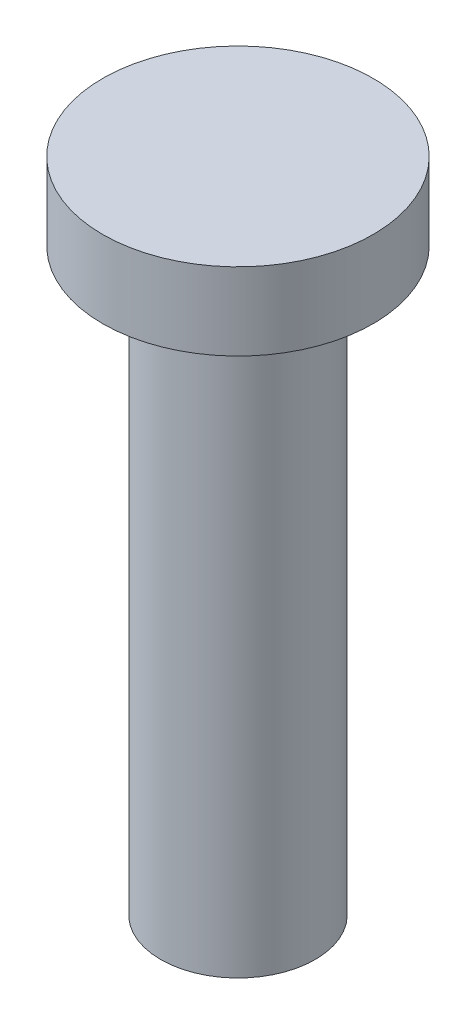
ISO-10303-21;
HEADER;
FILE_DESCRIPTION(('STEP AP214'),'2;1');
FILE_NAME('part.step','',(''),(''),'','','');
FILE_SCHEMA(('AUTOMOTIVE_DESIGN { 1 0 10303 214 1 1 1 1 }'));
ENDSEC;
DATA;
#1=APPLICATION_CONTEXT('core data for automotive mechanical design processes');
#2=APPLICATION_PROTOCOL_DEFINITION('international standard','automotive_design',2000,#1);
#3=PRODUCT_CONTEXT('',#1,'mechanical');
#4=PRODUCT('Part','Part','',(#3));
#5=PRODUCT_RELATED_PRODUCT_CATEGORY('part','',(#4));
#6=PRODUCT_DEFINITION_FORMATION('','',#4);
#7=PRODUCT_DEFINITION_CONTEXT('part definition',#1,'design');
#8=PRODUCT_DEFINITION('design','',#6,#7);
#9=PRODUCT_DEFINITION_SHAPE('','',#8);
#10=(LENGTH_UNIT() NAMED_UNIT(*) SI_UNIT(.MILLI.,.METRE.));
#11=(NAMED_UNIT(*) PLANE_ANGLE_UNIT() SI_UNIT($,.RADIAN.));
#12=(NAMED_UNIT(*) SI_UNIT($,.STERADIAN.) SOLID_ANGLE_UNIT());
#13=UNCERTAINTY_MEASURE_WITH_UNIT(LENGTH_MEASURE(1.E-05),#10,'distance_accuracy_value','');
#14=(GEOMETRIC_REPRESENTATION_CONTEXT(3) GLOBAL_UNCERTAINTY_ASSIGNED_CONTEXT((#13)) GLOBAL_UNIT_ASSIGNED_CONTEXT((#10,
#11,#12)) REPRESENTATION_CONTEXT('',''));
#15=CARTESIAN_POINT('',(0.,0.,0.));
#16=DIRECTION('',(0.,0.,1.));
#17=DIRECTION('',(1.,0.,0.));
#18=AXIS2_PLACEMENT_3D('',#15,#16,#17);
#19=CARTESIAN_POINT('',(0.,15.,0.));
#20=DIRECTION('',(0.,-1.,0.));
#21=DIRECTION('',(0.,0.,-1.));
#22=AXIS2_PLACEMENT_3D('',#19,#20,#21);
#23=CYLINDRICAL_SURFACE('',#22,2.);
#24=CARTESIAN_POINT('',(0.,15.,0.));
#25=DIRECTION('',(0.,1.,0.));
#26=DIRECTION('',(0.,0.,1.));
#27=AXIS2_PLACEMENT_3D('',#24,#25,#26);
#28=CIRCLE('',#27,2.);
#29=CARTESIAN_POINT('',(0.,15.,2.));
#30=VERTEX_POINT('',#29);
#31=EDGE_CURVE('E10',#30,#30,#28,.T.);
#32=ORIENTED_EDGE('',*,*,#31,.F.);
#33=EDGE_LOOP('',(#32));
#34=FACE_BOUND('',#33,.T.);
#35=CARTESIAN_POINT('',(0.,0.,0.));
#36=DIRECTION('',(0.,1.,0.));
#37=DIRECTION('',(0.,0.,1.));
#38=AXIS2_PLACEMENT_3D('',#35,#36,#37);
#39=CIRCLE('',#38,2.);
#40=CARTESIAN_POINT('',(0.,0.,2.));
#41=VERTEX_POINT('',#40);
#42=EDGE_CURVE('E32',#41,#41,#39,.T.);
#43=ORIENTED_EDGE('',*,*,#42,.T.);
#44=EDGE_LOOP('',(#43));
#45=FACE_BOUND('',#44,.T.);
#46=ADVANCED_FACE('F29',(#34,#45),#23,.T.);
#47=CARTESIAN_POINT('',(0.,0.,0.));
#48=DIRECTION('',(0.,1.,0.));
#49=DIRECTION('',(0.,0.,1.));
#50=AXIS2_PLACEMENT_3D('',#47,#48,#49);
#51=PLANE('',#50);
#52=ORIENTED_EDGE('',*,*,#42,.F.);
#53=EDGE_LOOP('',(#52));
#54=FACE_BOUND('',#53,.T.);
#55=ADVANCED_FACE('F57',(#54),#51,.F.);
#56=CARTESIAN_POINT('',(0.,15.,0.));
#57=DIRECTION('',(0.,1.,0.));
#58=DIRECTION('',(0.,0.,1.));
#59=AXIS2_PLACEMENT_3D('',#56,#57,#58);
#60=PLANE('',#59);
#61=CARTESIAN_POINT('',(0.,15.,0.));
#62=DIRECTION('',(0.,1.,0.));
#63=DIRECTION('',(0.,0.,1.));
#64=AXIS2_PLACEMENT_3D('',#61,#62,#63);
#65=CIRCLE('',#64,3.5);
#66=CARTESIAN_POINT('',(0.,15.,3.5));
#67=VERTEX_POINT('',#66);
#68=EDGE_CURVE('E41',#67,#67,#65,.T.);
#69=ORIENTED_EDGE('',*,*,#68,.F.);
#70=EDGE_LOOP('',(#69));
#71=FACE_BOUND('',#70,.T.);
#72=ORIENTED_EDGE('',*,*,#31,.T.);
#73=EDGE_LOOP('',(#72));
#74=FACE_BOUND('',#73,.T.);
#75=ADVANCED_FACE('F52',(#71,#74),#60,.F.);
#76=CARTESIAN_POINT('',(0.,17.,0.));
#77=DIRECTION('',(0.,-1.,0.));
#78=DIRECTION('',(0.,0.,-1.));
#79=AXIS2_PLACEMENT_3D('',#76,#77,#78);
#80=CYLINDRICAL_SURFACE('',#79,3.5);
#81=CARTESIAN_POINT('',(0.,17.,0.));
#82=DIRECTION('',(0.,1.,0.));
#83=DIRECTION('',(0.,0.,1.));
#84=AXIS2_PLACEMENT_3D('',#81,#82,#83);
#85=CIRCLE('',#84,3.5);
#86=CARTESIAN_POINT('',(0.,17.,3.5));
#87=VERTEX_POINT('',#86);
#88=EDGE_CURVE('E39',#87,#87,#85,.T.);
#89=ORIENTED_EDGE('',*,*,#88,.F.);
#90=EDGE_LOOP('',(#89));
#91=FACE_BOUND('',#90,.T.);
#92=ORIENTED_EDGE('',*,*,#68,.T.);
#93=EDGE_LOOP('',(#92));
#94=FACE_BOUND('',#93,.T.);
#95=ADVANCED_FACE('F49',(#91,#94),#80,.T.);
#96=CARTESIAN_POINT('',(0.,17.,0.));
#97=DIRECTION('',(0.,1.,0.));
#98=DIRECTION('',(0.,0.,1.));
#99=AXIS2_PLACEMENT_3D('',#96,#97,#98);
#100=PLANE('',#99);
#101=ORIENTED_EDGE('',*,*,#88,.T.);
#102=EDGE_LOOP('',(#101));
#103=FACE_BOUND('',#102,.T.);
#104=ADVANCED_FACE('F47',(#103),#100,.T.);
#105=CLOSED_SHELL('',(#46,#55,#75,#95,#104));
#106=MANIFOLD_SOLID_BREP('B2',#105);
#107=ADVANCED_BREP_SHAPE_REPRESENTATION('',(#18,#106),#14);
#108=SHAPE_DEFINITION_REPRESENTATION(#9,#107);
ENDSEC;
END-ISO-10303-21;
